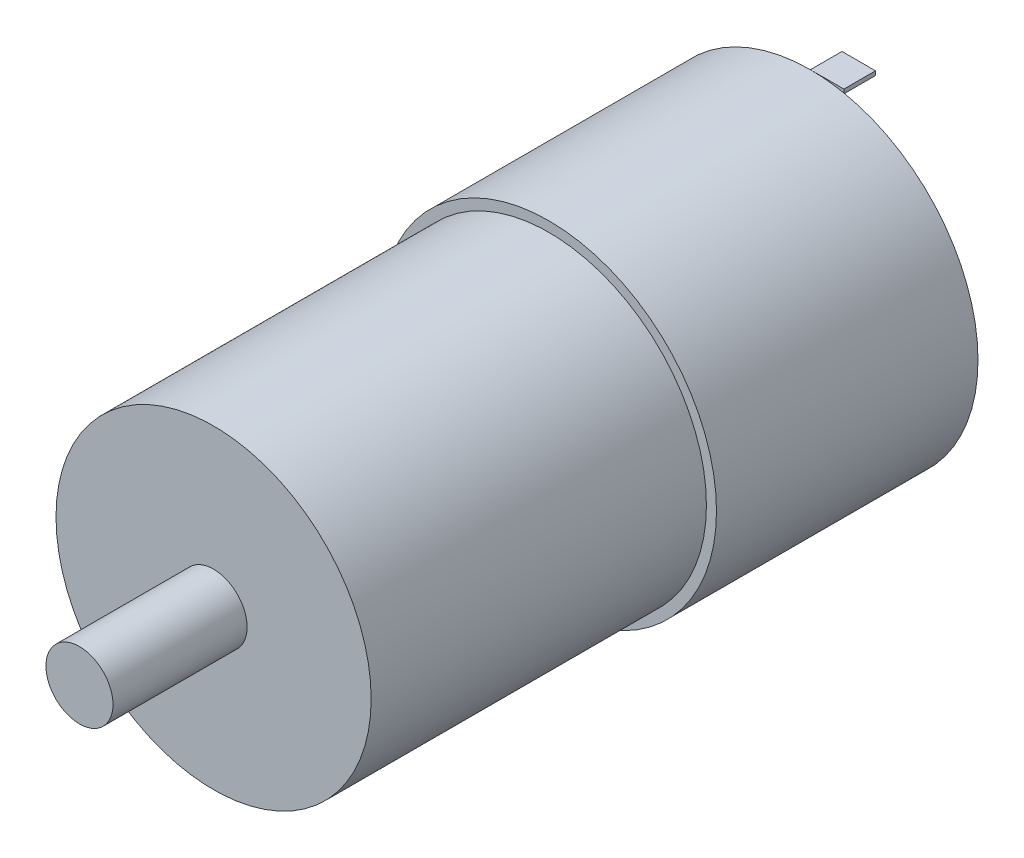
ISO-10303-21;
HEADER;
FILE_DESCRIPTION(('STEP AP214'),'2;1');
FILE_NAME('part.step','',(''),(''),'','','');
FILE_SCHEMA(('AUTOMOTIVE_DESIGN { 1 0 10303 214 1 1 1 1 }'));
ENDSEC;
DATA;
#1=APPLICATION_CONTEXT('core data for automotive mechanical design processes');
#2=APPLICATION_PROTOCOL_DEFINITION('international standard','automotive_design',2000,#1);
#3=PRODUCT_CONTEXT('',#1,'mechanical');
#4=PRODUCT('Part','Part','',(#3));
#5=PRODUCT_RELATED_PRODUCT_CATEGORY('part','',(#4));
#6=PRODUCT_DEFINITION_FORMATION('','',#4);
#7=PRODUCT_DEFINITION_CONTEXT('part definition',#1,'design');
#8=PRODUCT_DEFINITION('design','',#6,#7);
#9=PRODUCT_DEFINITION_SHAPE('','',#8);
#10=(LENGTH_UNIT() NAMED_UNIT(*) SI_UNIT(.MILLI.,.METRE.));
#11=(NAMED_UNIT(*) PLANE_ANGLE_UNIT() SI_UNIT($,.RADIAN.));
#12=(NAMED_UNIT(*) SI_UNIT($,.STERADIAN.) SOLID_ANGLE_UNIT());
#13=UNCERTAINTY_MEASURE_WITH_UNIT(LENGTH_MEASURE(1.E-05),#10,'distance_accuracy_value','');
#14=(GEOMETRIC_REPRESENTATION_CONTEXT(3) GLOBAL_UNCERTAINTY_ASSIGNED_CONTEXT((#13)) GLOBAL_UNIT_ASSIGNED_CONTEXT((#10,
#11,#12)) REPRESENTATION_CONTEXT('',''));
#15=CARTESIAN_POINT('',(0.,0.,0.));
#16=DIRECTION('',(0.,0.,1.));
#17=DIRECTION('',(1.,0.,0.));
#18=AXIS2_PLACEMENT_3D('',#15,#16,#17);
#19=CARTESIAN_POINT('',(0.,0.,39.));
#20=DIRECTION('',(0.,0.,-1.));
#21=DIRECTION('',(-1.,0.,0.));
#22=AXIS2_PLACEMENT_3D('',#19,#20,#21);
#23=CYLINDRICAL_SURFACE('',#22,25.);
#24=CARTESIAN_POINT('',(0.,0.,39.));
#25=DIRECTION('',(0.,0.,1.));
#26=DIRECTION('',(1.,0.,0.));
#27=AXIS2_PLACEMENT_3D('',#24,#25,#26);
#28=CIRCLE('',#27,25.);
#29=CARTESIAN_POINT('',(25.,0.,39.));
#30=VERTEX_POINT('',#29);
#31=EDGE_CURVE('E41',#30,#30,#28,.T.);
#32=ORIENTED_EDGE('',*,*,#31,.F.);
#33=EDGE_LOOP('',(#32));
#34=FACE_BOUND('',#33,.T.);
#35=CARTESIAN_POINT('',(0.,0.,0.));
#36=DIRECTION('',(0.,0.,1.));
#37=DIRECTION('',(1.,0.,0.));
#38=AXIS2_PLACEMENT_3D('',#35,#36,#37);
#39=CIRCLE('',#38,25.);
#40=CARTESIAN_POINT('',(5.,24.4948974278318,0.));
#41=VERTEX_POINT('',#40);
#42=CARTESIAN_POINT('',(0.,25.,0.));
#43=VERTEX_POINT('',#42);
#44=EDGE_CURVE('E36',#41,#43,#39,.T.);
#45=ORIENTED_EDGE('',*,*,#44,.T.);
#46=CARTESIAN_POINT('',(0.,-25.,0.));
#47=VERTEX_POINT('',#46);
#48=EDGE_CURVE('E178',#43,#47,#39,.T.);
#49=ORIENTED_EDGE('',*,*,#48,.T.);
#50=CARTESIAN_POINT('',(5.,-24.4948974278318,0.));
#51=VERTEX_POINT('',#50);
#52=EDGE_CURVE('E182',#47,#51,#39,.T.);
#53=ORIENTED_EDGE('',*,*,#52,.T.);
#54=EDGE_CURVE('E55',#51,#41,#39,.T.);
#55=ORIENTED_EDGE('',*,*,#54,.T.);
#56=EDGE_LOOP('',(#45,#49,#53,#55));
#57=FACE_BOUND('',#56,.T.);
#58=ADVANCED_FACE('F33',(#34,#57),#23,.T.);
#59=CARTESIAN_POINT('',(0.,0.,39.));
#60=DIRECTION('',(0.,0.,1.));
#61=DIRECTION('',(1.,0.,0.));
#62=AXIS2_PLACEMENT_3D('',#59,#60,#61);
#63=PLANE('',#62);
#64=CARTESIAN_POINT('',(0.,0.,39.));
#65=DIRECTION('',(0.,0.,1.));
#66=DIRECTION('',(1.,0.,0.));
#67=AXIS2_PLACEMENT_3D('',#64,#65,#66);
#68=CIRCLE('',#67,23.5);
#69=CARTESIAN_POINT('',(23.5,0.,39.));
#70=VERTEX_POINT('',#69);
#71=EDGE_CURVE('E167',#70,#70,#68,.T.);
#72=ORIENTED_EDGE('',*,*,#71,.F.);
#73=EDGE_LOOP('',(#72));
#74=FACE_BOUND('',#73,.T.);
#75=ORIENTED_EDGE('',*,*,#31,.T.);
#76=EDGE_LOOP('',(#75));
#77=FACE_BOUND('',#76,.T.);
#78=ADVANCED_FACE('F242',(#74,#77),#63,.T.);
#79=CARTESIAN_POINT('',(0.,0.,0.));
#80=DIRECTION('',(0.,0.,1.));
#81=DIRECTION('',(1.,0.,0.));
#82=AXIS2_PLACEMENT_3D('',#79,#80,#81);
#83=PLANE('',#82);
#84=ORIENTED_EDGE('',*,*,#54,.F.);
#85=DIRECTION('',(0.,-1.,0.));
#86=VECTOR('',#85,1.);
#87=CARTESIAN_POINT('',(5.,-24.179051934567,0.));
#88=LINE('',#87,#86);
#89=CARTESIAN_POINT('',(5.,-24.179051934567,0.));
#90=VERTEX_POINT('',#89);
#91=EDGE_CURVE('E50',#90,#51,#88,.T.);
#92=ORIENTED_EDGE('',*,*,#91,.F.);
#93=DIRECTION('',(-1.,0.,0.));
#94=VECTOR('',#93,1.);
#95=CARTESIAN_POINT('',(5.,-24.179051934567,0.));
#96=LINE('',#95,#94);
#97=CARTESIAN_POINT('',(0.,-24.179051934567,0.));
#98=VERTEX_POINT('',#97);
#99=EDGE_CURVE('E200',#90,#98,#96,.T.);
#100=ORIENTED_EDGE('',*,*,#99,.T.);
#101=DIRECTION('',(0.,-1.,0.));
#102=VECTOR('',#101,1.);
#103=CARTESIAN_POINT('',(0.,-24.179051934567,0.));
#104=LINE('',#103,#102);
#105=EDGE_CURVE('E187',#98,#47,#104,.T.);
#106=ORIENTED_EDGE('',*,*,#105,.T.);
#107=ORIENTED_EDGE('',*,*,#48,.F.);
#108=DIRECTION('',(0.,-1.,0.));
#109=VECTOR('',#108,1.);
#110=CARTESIAN_POINT('',(0.,24.3848163598557,0.));
#111=LINE('',#110,#109);
#112=CARTESIAN_POINT('',(0.,24.3848163598557,0.));
#113=VERTEX_POINT('',#112);
#114=EDGE_CURVE('E130',#43,#113,#111,.T.);
#115=ORIENTED_EDGE('',*,*,#114,.T.);
#116=DIRECTION('',(-1.,0.,0.));
#117=VECTOR('',#116,1.);
#118=CARTESIAN_POINT('',(5.,24.3848163598557,0.));
#119=LINE('',#118,#117);
#120=CARTESIAN_POINT('',(5.,24.3848163598557,0.));
#121=VERTEX_POINT('',#120);
#122=EDGE_CURVE('E160',#121,#113,#119,.T.);
#123=ORIENTED_EDGE('',*,*,#122,.F.);
#124=DIRECTION('',(0.,-1.,0.));
#125=VECTOR('',#124,1.);
#126=CARTESIAN_POINT('',(5.,24.3848163598557,0.));
#127=LINE('',#126,#125);
#128=EDGE_CURVE('E11',#41,#121,#127,.T.);
#129=ORIENTED_EDGE('',*,*,#128,.F.);
#130=EDGE_LOOP('',(#84,#92,#100,#106,#107,#115,#123,#129));
#131=FACE_BOUND('',#130,.T.);
#132=ADVANCED_FACE('F209',(#131),#83,.F.);
#133=CARTESIAN_POINT('',(0.,0.,89.));
#134=DIRECTION('',(0.,0.,-1.));
#135=DIRECTION('',(-1.,0.,0.));
#136=AXIS2_PLACEMENT_3D('',#133,#134,#135);
#137=CYLINDRICAL_SURFACE('',#136,23.5);
#138=CARTESIAN_POINT('',(0.,0.,89.));
#139=DIRECTION('',(0.,0.,1.));
#140=DIRECTION('',(1.,0.,0.));
#141=AXIS2_PLACEMENT_3D('',#138,#139,#140);
#142=CIRCLE('',#141,23.5);
#143=CARTESIAN_POINT('',(23.5,0.,89.));
#144=VERTEX_POINT('',#143);
#145=EDGE_CURVE('E170',#144,#144,#142,.T.);
#146=ORIENTED_EDGE('',*,*,#145,.F.);
#147=EDGE_LOOP('',(#146));
#148=FACE_BOUND('',#147,.T.);
#149=ORIENTED_EDGE('',*,*,#71,.T.);
#150=EDGE_LOOP('',(#149));
#151=FACE_BOUND('',#150,.T.);
#152=ADVANCED_FACE('F254',(#148,#151),#137,.T.);
#153=CARTESIAN_POINT('',(0.,0.,89.));
#154=DIRECTION('',(0.,0.,1.));
#155=DIRECTION('',(1.,0.,0.));
#156=AXIS2_PLACEMENT_3D('',#153,#154,#155);
#157=PLANE('',#156);
#158=CARTESIAN_POINT('',(0.,0.,89.));
#159=DIRECTION('',(0.,0.,1.));
#160=DIRECTION('',(1.,0.,0.));
#161=AXIS2_PLACEMENT_3D('',#158,#159,#160);
#162=CIRCLE('',#161,5.);
#163=CARTESIAN_POINT('',(5.,0.,89.));
#164=VERTEX_POINT('',#163);
#165=EDGE_CURVE('E163',#164,#164,#162,.T.);
#166=ORIENTED_EDGE('',*,*,#165,.F.);
#167=EDGE_LOOP('',(#166));
#168=FACE_BOUND('',#167,.T.);
#169=ORIENTED_EDGE('',*,*,#145,.T.);
#170=EDGE_LOOP('',(#169));
#171=FACE_BOUND('',#170,.T.);
#172=ADVANCED_FACE('F259',(#168,#171),#157,.T.);
#173=CARTESIAN_POINT('',(0.,0.,109.));
#174=DIRECTION('',(0.,0.,-1.));
#175=DIRECTION('',(-1.,0.,0.));
#176=AXIS2_PLACEMENT_3D('',#173,#174,#175);
#177=CYLINDRICAL_SURFACE('',#176,5.);
#178=CARTESIAN_POINT('',(0.,0.,109.));
#179=DIRECTION('',(0.,0.,1.));
#180=DIRECTION('',(1.,0.,0.));
#181=AXIS2_PLACEMENT_3D('',#178,#179,#180);
#182=CIRCLE('',#181,5.);
#183=CARTESIAN_POINT('',(5.,0.,109.));
#184=VERTEX_POINT('',#183);
#185=EDGE_CURVE('E164',#184,#184,#182,.T.);
#186=ORIENTED_EDGE('',*,*,#185,.F.);
#187=EDGE_LOOP('',(#186));
#188=FACE_BOUND('',#187,.T.);
#189=ORIENTED_EDGE('',*,*,#165,.T.);
#190=EDGE_LOOP('',(#189));
#191=FACE_BOUND('',#190,.T.);
#192=ADVANCED_FACE('F263',(#188,#191),#177,.T.);
#193=CARTESIAN_POINT('',(0.,0.,109.));
#194=DIRECTION('',(0.,0.,1.));
#195=DIRECTION('',(1.,0.,0.));
#196=AXIS2_PLACEMENT_3D('',#193,#194,#195);
#197=PLANE('',#196);
#198=ORIENTED_EDGE('',*,*,#185,.T.);
#199=EDGE_LOOP('',(#198));
#200=FACE_BOUND('',#199,.T.);
#201=ADVANCED_FACE('F267',(#200),#197,.T.);
#202=CARTESIAN_POINT('',(5.,24.3848163598557,0.));
#203=DIRECTION('',(0.,0.,-1.));
#204=DIRECTION('',(-1.,0.,0.));
#205=AXIS2_PLACEMENT_3D('',#202,#203,#204);
#206=PLANE('',#205);
#207=ORIENTED_EDGE('',*,*,#44,.F.);
#208=CARTESIAN_POINT('',(5.,25.,0.));
#209=VERTEX_POINT('',#208);
#210=EDGE_CURVE('E43',#209,#41,#127,.T.);
#211=ORIENTED_EDGE('',*,*,#210,.F.);
#212=DIRECTION('',(-1.,0.,0.));
#213=VECTOR('',#212,1.);
#214=CARTESIAN_POINT('',(5.,25.,0.));
#215=LINE('',#214,#213);
#216=EDGE_CURVE('E145',#209,#43,#215,.T.);
#217=ORIENTED_EDGE('',*,*,#216,.T.);
#218=EDGE_LOOP('',(#207,#211,#217));
#219=FACE_BOUND('',#218,.T.);
#220=ADVANCED_FACE('F226',(#219),#206,.F.);
#221=CARTESIAN_POINT('',(5.,24.3848163598557,0.));
#222=DIRECTION('',(0.,1.,0.));
#223=DIRECTION('',(0.,0.,1.));
#224=AXIS2_PLACEMENT_3D('',#221,#222,#223);
#225=PLANE('',#224);
#226=DIRECTION('',(0.,0.,-1.));
#227=VECTOR('',#226,1.);
#228=CARTESIAN_POINT('',(0.,24.3848163598557,0.));
#229=LINE('',#228,#227);
#230=CARTESIAN_POINT('',(0.,24.3848163598557,-4.71788686902147));
#231=VERTEX_POINT('',#230);
#232=EDGE_CURVE('E132',#113,#231,#229,.T.);
#233=ORIENTED_EDGE('',*,*,#232,.T.);
#234=DIRECTION('',(-1.,0.,0.));
#235=VECTOR('',#234,1.);
#236=CARTESIAN_POINT('',(5.,24.3848163598557,-4.71788686902147));
#237=LINE('',#236,#235);
#238=CARTESIAN_POINT('',(5.,24.3848163598557,-4.71788686902147));
#239=VERTEX_POINT('',#238);
#240=EDGE_CURVE('E157',#239,#231,#237,.T.);
#241=ORIENTED_EDGE('',*,*,#240,.F.);
#242=DIRECTION('',(0.,0.,-1.));
#243=VECTOR('',#242,1.);
#244=CARTESIAN_POINT('',(5.,24.3848163598557,0.));
#245=LINE('',#244,#243);
#246=EDGE_CURVE('E139',#121,#239,#245,.T.);
#247=ORIENTED_EDGE('',*,*,#246,.F.);
#248=ORIENTED_EDGE('',*,*,#122,.T.);
#249=EDGE_LOOP('',(#233,#241,#247,#248));
#250=FACE_BOUND('',#249,.T.);
#251=ADVANCED_FACE('F219',(#250),#225,.F.);
#252=CARTESIAN_POINT('',(5.,24.3848163598557,-4.71788686902147));
#253=DIRECTION('',(0.,0.,1.));
#254=DIRECTION('',(1.,0.,0.));
#255=AXIS2_PLACEMENT_3D('',#252,#253,#254);
#256=PLANE('',#255);
#257=DIRECTION('',(0.,1.,0.));
#258=VECTOR('',#257,1.);
#259=CARTESIAN_POINT('',(0.,24.3848163598557,-4.71788686902147));
#260=LINE('',#259,#258);
#261=CARTESIAN_POINT('',(0.,25.,-4.71788686902147));
#262=VERTEX_POINT('',#261);
#263=EDGE_CURVE('E148',#231,#262,#260,.T.);
#264=ORIENTED_EDGE('',*,*,#263,.T.);
#265=DIRECTION('',(-1.,0.,0.));
#266=VECTOR('',#265,1.);
#267=CARTESIAN_POINT('',(5.,25.,-4.71788686902147));
#268=LINE('',#267,#266);
#269=CARTESIAN_POINT('',(5.,25.,-4.71788686902147));
#270=VERTEX_POINT('',#269);
#271=EDGE_CURVE('E154',#270,#262,#268,.T.);
#272=ORIENTED_EDGE('',*,*,#271,.F.);
#273=DIRECTION('',(0.,1.,0.));
#274=VECTOR('',#273,1.);
#275=CARTESIAN_POINT('',(5.,24.3848163598557,-4.71788686902147));
#276=LINE('',#275,#274);
#277=EDGE_CURVE('E142',#239,#270,#276,.T.);
#278=ORIENTED_EDGE('',*,*,#277,.F.);
#279=ORIENTED_EDGE('',*,*,#240,.T.);
#280=EDGE_LOOP('',(#264,#272,#278,#279));
#281=FACE_BOUND('',#280,.T.);
#282=ADVANCED_FACE('F232',(#281),#256,.F.);
#283=CARTESIAN_POINT('',(5.,25.,0.));
#284=DIRECTION('',(0.,-1.,0.));
#285=DIRECTION('',(0.,0.,-1.));
#286=AXIS2_PLACEMENT_3D('',#283,#284,#285);
#287=PLANE('',#286);
#288=DIRECTION('',(0.,0.,1.));
#289=VECTOR('',#288,1.);
#290=CARTESIAN_POINT('',(0.,25.,0.));
#291=LINE('',#290,#289);
#292=EDGE_CURVE('E140',#262,#43,#291,.T.);
#293=ORIENTED_EDGE('',*,*,#292,.T.);
#294=ORIENTED_EDGE('',*,*,#216,.F.);
#295=DIRECTION('',(0.,0.,1.));
#296=VECTOR('',#295,1.);
#297=CARTESIAN_POINT('',(5.,25.,0.));
#298=LINE('',#297,#296);
#299=EDGE_CURVE('E144',#270,#209,#298,.T.);
#300=ORIENTED_EDGE('',*,*,#299,.F.);
#301=ORIENTED_EDGE('',*,*,#271,.T.);
#302=EDGE_LOOP('',(#293,#294,#300,#301));
#303=FACE_BOUND('',#302,.T.);
#304=ADVANCED_FACE('F230',(#303),#287,.F.);
#305=CARTESIAN_POINT('',(5.,0.,0.));
#306=DIRECTION('',(-1.,0.,0.));
#307=DIRECTION('',(0.,0.,1.));
#308=AXIS2_PLACEMENT_3D('',#305,#306,#307);
#309=PLANE('',#308);
#310=ORIENTED_EDGE('',*,*,#210,.T.);
#311=ORIENTED_EDGE('',*,*,#128,.T.);
#312=ORIENTED_EDGE('',*,*,#246,.T.);
#313=ORIENTED_EDGE('',*,*,#277,.T.);
#314=ORIENTED_EDGE('',*,*,#299,.T.);
#315=EDGE_LOOP('',(#310,#311,#312,#313,#314));
#316=FACE_BOUND('',#315,.T.);
#317=ADVANCED_FACE('F222',(#316),#309,.F.);
#318=CARTESIAN_POINT('',(0.,0.,0.));
#319=DIRECTION('',(-1.,0.,0.));
#320=DIRECTION('',(0.,0.,1.));
#321=AXIS2_PLACEMENT_3D('',#318,#319,#320);
#322=PLANE('',#321);
#323=ORIENTED_EDGE('',*,*,#114,.F.);
#324=ORIENTED_EDGE('',*,*,#292,.F.);
#325=ORIENTED_EDGE('',*,*,#263,.F.);
#326=ORIENTED_EDGE('',*,*,#232,.F.);
#327=EDGE_LOOP('',(#323,#324,#325,#326));
#328=FACE_BOUND('',#327,.T.);
#329=ADVANCED_FACE('F215',(#328),#322,.T.);
#330=CARTESIAN_POINT('',(5.,-24.179051934567,0.));
#331=DIRECTION('',(0.,0.,-1.));
#332=DIRECTION('',(-1.,0.,0.));
#333=AXIS2_PLACEMENT_3D('',#330,#331,#332);
#334=PLANE('',#333);
#335=CARTESIAN_POINT('',(5.,-25.5183347471899,0.));
#336=VERTEX_POINT('',#335);
#337=EDGE_CURVE('E107',#51,#336,#88,.T.);
#338=ORIENTED_EDGE('',*,*,#337,.F.);
#339=ORIENTED_EDGE('',*,*,#52,.F.);
#340=CARTESIAN_POINT('',(0.,-25.5183347471899,0.));
#341=VERTEX_POINT('',#340);
#342=EDGE_CURVE('E128',#47,#341,#104,.T.);
#343=ORIENTED_EDGE('',*,*,#342,.T.);
#344=DIRECTION('',(-1.,0.,0.));
#345=VECTOR('',#344,1.);
#346=CARTESIAN_POINT('',(5.,-25.5183347471899,0.));
#347=LINE('',#346,#345);
#348=EDGE_CURVE('E120',#336,#341,#347,.T.);
#349=ORIENTED_EDGE('',*,*,#348,.F.);
#350=EDGE_LOOP('',(#338,#339,#343,#349));
#351=FACE_BOUND('',#350,.T.);
#352=ADVANCED_FACE('F126',(#351),#334,.F.);
#353=CARTESIAN_POINT('',(5.,-25.5183347471899,0.));
#354=DIRECTION('',(0.,1.,0.));
#355=DIRECTION('',(0.,0.,1.));
#356=AXIS2_PLACEMENT_3D('',#353,#354,#355);
#357=PLANE('',#356);
#358=DIRECTION('',(0.,0.,-1.));
#359=VECTOR('',#358,1.);
#360=CARTESIAN_POINT('',(0.,-25.5183347471899,0.));
#361=LINE('',#360,#359);
#362=CARTESIAN_POINT('',(0.,-25.5183347471899,-4.71788686902147));
#363=VERTEX_POINT('',#362);
#364=EDGE_CURVE('E189',#341,#363,#361,.T.);
#365=ORIENTED_EDGE('',*,*,#364,.T.);
#366=DIRECTION('',(-1.,0.,0.));
#367=VECTOR('',#366,1.);
#368=CARTESIAN_POINT('',(5.,-25.5183347471899,-4.71788686902147));
#369=LINE('',#368,#367);
#370=CARTESIAN_POINT('',(5.,-25.5183347471899,-4.71788686902147));
#371=VERTEX_POINT('',#370);
#372=EDGE_CURVE('E122',#371,#363,#369,.T.);
#373=ORIENTED_EDGE('',*,*,#372,.F.);
#374=DIRECTION('',(0.,0.,-1.));
#375=VECTOR('',#374,1.);
#376=CARTESIAN_POINT('',(5.,-25.5183347471899,0.));
#377=LINE('',#376,#375);
#378=EDGE_CURVE('E110',#336,#371,#377,.T.);
#379=ORIENTED_EDGE('',*,*,#378,.F.);
#380=ORIENTED_EDGE('',*,*,#348,.T.);
#381=EDGE_LOOP('',(#365,#373,#379,#380));
#382=FACE_BOUND('',#381,.T.);
#383=ADVANCED_FACE('F119',(#382),#357,.F.);
#384=CARTESIAN_POINT('',(5.,-24.179051934567,-4.71788686902147));
#385=DIRECTION('',(0.,0.,1.));
#386=DIRECTION('',(1.,0.,0.));
#387=AXIS2_PLACEMENT_3D('',#384,#385,#386);
#388=PLANE('',#387);
#389=DIRECTION('',(0.,1.,0.));
#390=VECTOR('',#389,1.);
#391=CARTESIAN_POINT('',(0.,-24.179051934567,-4.71788686902147));
#392=LINE('',#391,#390);
#393=CARTESIAN_POINT('',(0.,-24.179051934567,-4.71788686902147));
#394=VERTEX_POINT('',#393);
#395=EDGE_CURVE('E196',#363,#394,#392,.T.);
#396=ORIENTED_EDGE('',*,*,#395,.T.);
#397=DIRECTION('',(-1.,0.,0.));
#398=VECTOR('',#397,1.);
#399=CARTESIAN_POINT('',(5.,-24.179051934567,-4.71788686902147));
#400=LINE('',#399,#398);
#401=CARTESIAN_POINT('',(5.,-24.179051934567,-4.71788686902147));
#402=VERTEX_POINT('',#401);
#403=EDGE_CURVE('E134',#402,#394,#400,.T.);
#404=ORIENTED_EDGE('',*,*,#403,.F.);
#405=DIRECTION('',(0.,1.,0.));
#406=VECTOR('',#405,1.);
#407=CARTESIAN_POINT('',(5.,-24.179051934567,-4.71788686902147));
#408=LINE('',#407,#406);
#409=EDGE_CURVE('E124',#371,#402,#408,.T.);
#410=ORIENTED_EDGE('',*,*,#409,.F.);
#411=ORIENTED_EDGE('',*,*,#372,.T.);
#412=EDGE_LOOP('',(#396,#404,#410,#411));
#413=FACE_BOUND('',#412,.T.);
#414=ADVANCED_FACE('F208',(#413),#388,.F.);
#415=CARTESIAN_POINT('',(5.,-24.179051934567,0.));
#416=DIRECTION('',(0.,-1.,0.));
#417=DIRECTION('',(0.,0.,-1.));
#418=AXIS2_PLACEMENT_3D('',#415,#416,#417);
#419=PLANE('',#418);
#420=DIRECTION('',(0.,0.,1.));
#421=VECTOR('',#420,1.);
#422=CARTESIAN_POINT('',(0.,-24.179051934567,0.));
#423=LINE('',#422,#421);
#424=EDGE_CURVE('E115',#394,#98,#423,.T.);
#425=ORIENTED_EDGE('',*,*,#424,.T.);
#426=ORIENTED_EDGE('',*,*,#99,.F.);
#427=DIRECTION('',(0.,0.,1.));
#428=VECTOR('',#427,1.);
#429=CARTESIAN_POINT('',(5.,-24.179051934567,0.));
#430=LINE('',#429,#428);
#431=EDGE_CURVE('E193',#402,#90,#430,.T.);
#432=ORIENTED_EDGE('',*,*,#431,.F.);
#433=ORIENTED_EDGE('',*,*,#403,.T.);
#434=EDGE_LOOP('',(#425,#426,#432,#433));
#435=FACE_BOUND('',#434,.T.);
#436=ADVANCED_FACE('F205',(#435),#419,.F.);
#437=CARTESIAN_POINT('',(5.,0.,0.));
#438=DIRECTION('',(1.,0.,0.));
#439=DIRECTION('',(0.,0.,-1.));
#440=AXIS2_PLACEMENT_3D('',#437,#438,#439);
#441=PLANE('',#440);
#442=ORIENTED_EDGE('',*,*,#91,.T.);
#443=ORIENTED_EDGE('',*,*,#337,.T.);
#444=ORIENTED_EDGE('',*,*,#378,.T.);
#445=ORIENTED_EDGE('',*,*,#409,.T.);
#446=ORIENTED_EDGE('',*,*,#431,.T.);
#447=EDGE_LOOP('',(#442,#443,#444,#445,#446));
#448=FACE_BOUND('',#447,.T.);
#449=ADVANCED_FACE('F109',(#448),#441,.T.);
#450=CARTESIAN_POINT('',(0.,0.,0.));
#451=DIRECTION('',(1.,0.,0.));
#452=DIRECTION('',(0.,0.,-1.));
#453=AXIS2_PLACEMENT_3D('',#450,#451,#452);
#454=PLANE('',#453);
#455=ORIENTED_EDGE('',*,*,#105,.F.);
#456=ORIENTED_EDGE('',*,*,#424,.F.);
#457=ORIENTED_EDGE('',*,*,#395,.F.);
#458=ORIENTED_EDGE('',*,*,#364,.F.);
#459=ORIENTED_EDGE('',*,*,#342,.F.);
#460=EDGE_LOOP('',(#455,#456,#457,#458,#459));
#461=FACE_BOUND('',#460,.T.);
#462=ADVANCED_FACE('F185',(#461),#454,.F.);
#463=CLOSED_SHELL('',(#58,#78,#132,#152,#172,#192,#201,#220,#251,#282,#304,#317,#329,#352,#383,
#414,#436,#449,#462));
#464=MANIFOLD_SOLID_BREP('B2',#463);
#465=ADVANCED_BREP_SHAPE_REPRESENTATION('',(#18,#464),#14);
#466=SHAPE_DEFINITION_REPRESENTATION(#9,#465);
ENDSEC;
END-ISO-10303-21;
